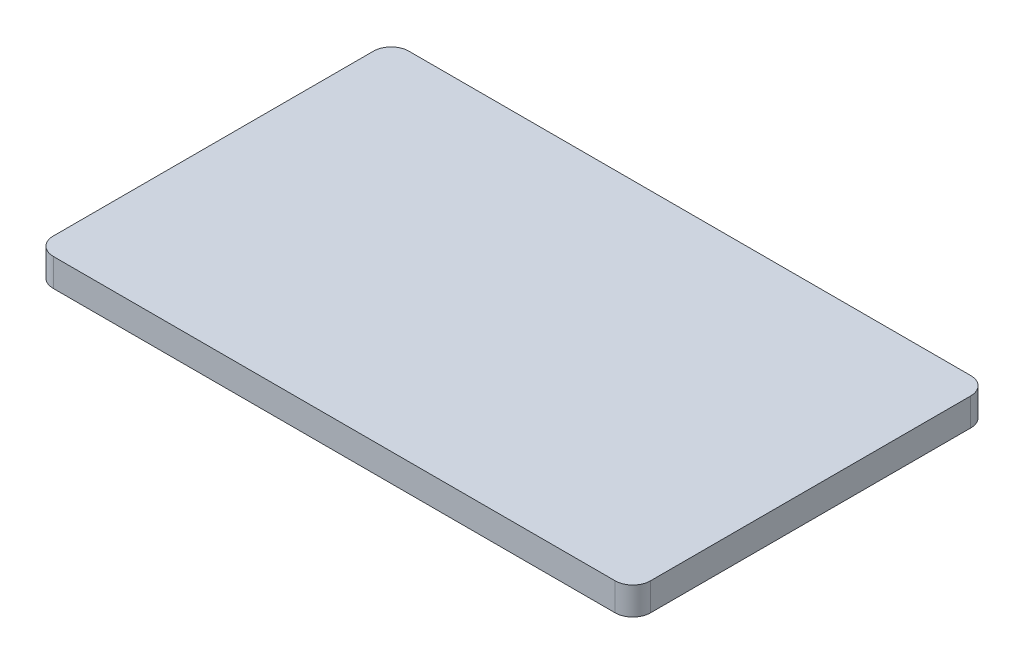
ISO-10303-21;
HEADER;
FILE_DESCRIPTION(('STEP AP214'),'2;1');
FILE_NAME('part.step','',(''),(''),'','','');
FILE_SCHEMA(('AUTOMOTIVE_DESIGN { 1 0 10303 214 1 1 1 1 }'));
ENDSEC;
DATA;
#1=APPLICATION_CONTEXT('core data for automotive mechanical design processes');
#2=APPLICATION_PROTOCOL_DEFINITION('international standard','automotive_design',2000,#1);
#3=PRODUCT_CONTEXT('',#1,'mechanical');
#4=PRODUCT('Part','Part','',(#3));
#5=PRODUCT_RELATED_PRODUCT_CATEGORY('part','',(#4));
#6=PRODUCT_DEFINITION_FORMATION('','',#4);
#7=PRODUCT_DEFINITION_CONTEXT('part definition',#1,'design');
#8=PRODUCT_DEFINITION('design','',#6,#7);
#9=PRODUCT_DEFINITION_SHAPE('','',#8);
#10=(LENGTH_UNIT() NAMED_UNIT(*) SI_UNIT(.MILLI.,.METRE.));
#11=(NAMED_UNIT(*) PLANE_ANGLE_UNIT() SI_UNIT($,.RADIAN.));
#12=(NAMED_UNIT(*) SI_UNIT($,.STERADIAN.) SOLID_ANGLE_UNIT());
#13=UNCERTAINTY_MEASURE_WITH_UNIT(LENGTH_MEASURE(1.E-05),#10,'distance_accuracy_value','');
#14=(GEOMETRIC_REPRESENTATION_CONTEXT(3) GLOBAL_UNCERTAINTY_ASSIGNED_CONTEXT((#13)) GLOBAL_UNIT_ASSIGNED_CONTEXT((#10,
#11,#12)) REPRESENTATION_CONTEXT('',''));
#15=CARTESIAN_POINT('',(0.,0.,0.));
#16=DIRECTION('',(0.,0.,1.));
#17=DIRECTION('',(1.,0.,0.));
#18=AXIS2_PLACEMENT_3D('',#15,#16,#17);
#19=CARTESIAN_POINT('',(107.5,10.,64.0000000000002));
#20=DIRECTION('',(-1.,0.,0.));
#21=DIRECTION('',(0.,0.,1.));
#22=AXIS2_PLACEMENT_3D('',#19,#20,#21);
#23=PLANE('',#22);
#24=DIRECTION('',(0.,0.,-1.));
#25=VECTOR('',#24,1.);
#26=CARTESIAN_POINT('',(107.5,10.,64.0000000000002));
#27=LINE('',#26,#25);
#28=CARTESIAN_POINT('',(107.5,10.,57.6500000000002));
#29=VERTEX_POINT('',#28);
#30=CARTESIAN_POINT('',(107.5,10.,-57.65));
#31=VERTEX_POINT('',#30);
#32=EDGE_CURVE('E129',#29,#31,#27,.T.);
#33=ORIENTED_EDGE('',*,*,#32,.F.);
#34=DIRECTION('',(0.,-1.,0.));
#35=VECTOR('',#34,1.);
#36=CARTESIAN_POINT('',(107.5,10.,57.6500000000002));
#37=LINE('',#36,#35);
#38=CARTESIAN_POINT('',(107.5,0.,57.6500000000002));
#39=VERTEX_POINT('',#38);
#40=EDGE_CURVE('E11',#29,#39,#37,.T.);
#41=ORIENTED_EDGE('',*,*,#40,.T.);
#42=DIRECTION('',(0.,0.,-1.));
#43=VECTOR('',#42,1.);
#44=CARTESIAN_POINT('',(107.5,0.,64.0000000000004));
#45=LINE('',#44,#43);
#46=CARTESIAN_POINT('',(107.5,0.,-57.65));
#47=VERTEX_POINT('',#46);
#48=EDGE_CURVE('E131',#39,#47,#45,.T.);
#49=ORIENTED_EDGE('',*,*,#48,.T.);
#50=DIRECTION('',(0.,-1.,0.));
#51=VECTOR('',#50,1.);
#52=CARTESIAN_POINT('',(107.5,10.,-57.65));
#53=LINE('',#52,#51);
#54=EDGE_CURVE('E42',#47,#31,#53,.F.);
#55=ORIENTED_EDGE('',*,*,#54,.T.);
#56=EDGE_LOOP('',(#33,#41,#49,#55));
#57=FACE_BOUND('',#56,.T.);
#58=ADVANCED_FACE('F34',(#57),#23,.F.);
#59=CARTESIAN_POINT('',(-107.5,10.,-63.9999999999996));
#60=DIRECTION('',(0.,0.,1.));
#61=DIRECTION('',(1.,0.,0.));
#62=AXIS2_PLACEMENT_3D('',#59,#60,#61);
#63=PLANE('',#62);
#64=DIRECTION('',(-1.,0.,0.));
#65=VECTOR('',#64,1.);
#66=CARTESIAN_POINT('',(-107.5,1.94289029309402E-13,-64.));
#67=LINE('',#66,#65);
#68=CARTESIAN_POINT('',(101.15,0.,-64.));
#69=VERTEX_POINT('',#68);
#70=CARTESIAN_POINT('',(-101.15,1.94289029309402E-13,-64.));
#71=VERTEX_POINT('',#70);
#72=EDGE_CURVE('E127',#69,#71,#67,.T.);
#73=ORIENTED_EDGE('',*,*,#72,.T.);
#74=DIRECTION('',(0.,-1.,0.));
#75=VECTOR('',#74,1.);
#76=CARTESIAN_POINT('',(-101.15,10.0000000000002,-63.9999999999996));
#77=LINE('',#76,#75);
#78=CARTESIAN_POINT('',(-101.15,10.0000000000002,-63.9999999999996));
#79=VERTEX_POINT('',#78);
#80=EDGE_CURVE('E106',#71,#79,#77,.F.);
#81=ORIENTED_EDGE('',*,*,#80,.T.);
#82=DIRECTION('',(-1.,0.,0.));
#83=VECTOR('',#82,1.);
#84=CARTESIAN_POINT('',(-107.5,10.,-63.9999999999996));
#85=LINE('',#84,#83);
#86=CARTESIAN_POINT('',(101.15,10.,-64.));
#87=VERTEX_POINT('',#86);
#88=EDGE_CURVE('E167',#87,#79,#85,.T.);
#89=ORIENTED_EDGE('',*,*,#88,.F.);
#90=DIRECTION('',(0.,-1.,0.));
#91=VECTOR('',#90,1.);
#92=CARTESIAN_POINT('',(101.15,10.,-64.));
#93=LINE('',#92,#91);
#94=EDGE_CURVE('E111',#87,#69,#93,.T.);
#95=ORIENTED_EDGE('',*,*,#94,.T.);
#96=EDGE_LOOP('',(#73,#81,#89,#95));
#97=FACE_BOUND('',#96,.T.);
#98=ADVANCED_FACE('F171',(#97),#63,.F.);
#99=CARTESIAN_POINT('',(-107.5,10.,64.));
#100=DIRECTION('',(1.,0.,0.));
#101=DIRECTION('',(0.,0.,-1.));
#102=AXIS2_PLACEMENT_3D('',#99,#100,#101);
#103=PLANE('',#102);
#104=DIRECTION('',(0.,0.,1.));
#105=VECTOR('',#104,1.);
#106=CARTESIAN_POINT('',(-107.5,10.,64.));
#107=LINE('',#106,#105);
#108=CARTESIAN_POINT('',(-107.5,10.,-57.6499999999996));
#109=VERTEX_POINT('',#108);
#110=CARTESIAN_POINT('',(-107.5,10.,57.65));
#111=VERTEX_POINT('',#110);
#112=EDGE_CURVE('E120',#109,#111,#107,.T.);
#113=ORIENTED_EDGE('',*,*,#112,.F.);
#114=DIRECTION('',(0.,-1.,0.));
#115=VECTOR('',#114,1.);
#116=CARTESIAN_POINT('',(-107.5,10.,-57.6499999999996));
#117=LINE('',#116,#115);
#118=CARTESIAN_POINT('',(-107.5,0.,-57.65));
#119=VERTEX_POINT('',#118);
#120=EDGE_CURVE('E105',#109,#119,#117,.T.);
#121=ORIENTED_EDGE('',*,*,#120,.T.);
#122=DIRECTION('',(0.,0.,1.));
#123=VECTOR('',#122,1.);
#124=CARTESIAN_POINT('',(-107.5,1.94289029309402E-13,64.));
#125=LINE('',#124,#123);
#126=CARTESIAN_POINT('',(-107.5,0.,57.6500000000002));
#127=VERTEX_POINT('',#126);
#128=EDGE_CURVE('E118',#119,#127,#125,.T.);
#129=ORIENTED_EDGE('',*,*,#128,.T.);
#130=DIRECTION('',(0.,-1.,0.));
#131=VECTOR('',#130,1.);
#132=CARTESIAN_POINT('',(-107.5,10.,57.65));
#133=LINE('',#132,#131);
#134=EDGE_CURVE('E122',#127,#111,#133,.F.);
#135=ORIENTED_EDGE('',*,*,#134,.T.);
#136=EDGE_LOOP('',(#113,#121,#129,#135));
#137=FACE_BOUND('',#136,.T.);
#138=ADVANCED_FACE('F117',(#137),#103,.F.);
#139=CARTESIAN_POINT('',(-107.5,10.,64.));
#140=DIRECTION('',(0.,0.,-1.));
#141=DIRECTION('',(-1.,0.,0.));
#142=AXIS2_PLACEMENT_3D('',#139,#140,#141);
#143=PLANE('',#142);
#144=DIRECTION('',(1.,0.,0.));
#145=VECTOR('',#144,1.);
#146=CARTESIAN_POINT('',(-107.5,10.,64.));
#147=LINE('',#146,#145);
#148=CARTESIAN_POINT('',(-101.15,9.99999999999998,64.));
#149=VERTEX_POINT('',#148);
#150=CARTESIAN_POINT('',(101.15,10.,64.0000000000002));
#151=VERTEX_POINT('',#150);
#152=EDGE_CURVE('E135',#149,#151,#147,.T.);
#153=ORIENTED_EDGE('',*,*,#152,.F.);
#154=DIRECTION('',(0.,-1.,0.));
#155=VECTOR('',#154,1.);
#156=CARTESIAN_POINT('',(-101.15,9.99999999999998,64.));
#157=LINE('',#156,#155);
#158=CARTESIAN_POINT('',(-101.15,0.,64.));
#159=VERTEX_POINT('',#158);
#160=EDGE_CURVE('E152',#149,#159,#157,.T.);
#161=ORIENTED_EDGE('',*,*,#160,.T.);
#162=DIRECTION('',(1.,0.,0.));
#163=VECTOR('',#162,1.);
#164=CARTESIAN_POINT('',(-107.5,1.94289029309402E-13,64.));
#165=LINE('',#164,#163);
#166=CARTESIAN_POINT('',(101.15,0.,64.0000000000004));
#167=VERTEX_POINT('',#166);
#168=EDGE_CURVE('E126',#159,#167,#165,.T.);
#169=ORIENTED_EDGE('',*,*,#168,.T.);
#170=DIRECTION('',(0.,-1.,0.));
#171=VECTOR('',#170,1.);
#172=CARTESIAN_POINT('',(101.15,10.,64.0000000000002));
#173=LINE('',#172,#171);
#174=EDGE_CURVE('E49',#167,#151,#173,.F.);
#175=ORIENTED_EDGE('',*,*,#174,.T.);
#176=EDGE_LOOP('',(#153,#161,#169,#175));
#177=FACE_BOUND('',#176,.T.);
#178=ADVANCED_FACE('F178',(#177),#143,.F.);
#179=CARTESIAN_POINT('',(0.,10.,0.));
#180=DIRECTION('',(0.,-1.,0.));
#181=DIRECTION('',(0.,0.,-1.));
#182=AXIS2_PLACEMENT_3D('',#179,#180,#181);
#183=PLANE('',#182);
#184=ORIENTED_EDGE('',*,*,#88,.T.);
#185=CARTESIAN_POINT('',(-101.15,10.,-57.6499999999996));
#186=DIRECTION('',(0.,-1.,0.));
#187=DIRECTION('',(0.,0.,-1.));
#188=AXIS2_PLACEMENT_3D('',#185,#186,#187);
#189=CIRCLE('',#188,6.35);
#190=EDGE_CURVE('E149',#79,#109,#189,.F.);
#191=ORIENTED_EDGE('',*,*,#190,.T.);
#192=ORIENTED_EDGE('',*,*,#112,.T.);
#193=CARTESIAN_POINT('',(-101.15,10.,57.65));
#194=DIRECTION('',(0.,-1.,0.));
#195=DIRECTION('',(0.,0.,-1.));
#196=AXIS2_PLACEMENT_3D('',#193,#194,#195);
#197=CIRCLE('',#196,6.35);
#198=EDGE_CURVE('E56',#111,#149,#197,.F.);
#199=ORIENTED_EDGE('',*,*,#198,.T.);
#200=ORIENTED_EDGE('',*,*,#152,.T.);
#201=CARTESIAN_POINT('',(101.15,10.,57.6500000000002));
#202=DIRECTION('',(0.,-1.,0.));
#203=DIRECTION('',(0.,0.,-1.));
#204=AXIS2_PLACEMENT_3D('',#201,#202,#203);
#205=CIRCLE('',#204,6.35);
#206=EDGE_CURVE('E146',#151,#29,#205,.F.);
#207=ORIENTED_EDGE('',*,*,#206,.T.);
#208=ORIENTED_EDGE('',*,*,#32,.T.);
#209=CARTESIAN_POINT('',(101.15,10.,-57.65));
#210=DIRECTION('',(0.,-1.,0.));
#211=DIRECTION('',(0.,0.,-1.));
#212=AXIS2_PLACEMENT_3D('',#209,#210,#211);
#213=CIRCLE('',#212,6.35);
#214=EDGE_CURVE('E144',#31,#87,#213,.F.);
#215=ORIENTED_EDGE('',*,*,#214,.T.);
#216=EDGE_LOOP('',(#184,#191,#192,#199,#200,#207,#208,#215));
#217=FACE_BOUND('',#216,.T.);
#218=ADVANCED_FACE('F164',(#217),#183,.F.);
#219=CARTESIAN_POINT('',(0.,0.,0.));
#220=DIRECTION('',(0.,-1.,0.));
#221=DIRECTION('',(0.,0.,-1.));
#222=AXIS2_PLACEMENT_3D('',#219,#220,#221);
#223=PLANE('',#222);
#224=ORIENTED_EDGE('',*,*,#128,.F.);
#225=CARTESIAN_POINT('',(-101.15,0.,-57.65));
#226=DIRECTION('',(0.,-1.,0.));
#227=DIRECTION('',(0.,0.,-1.));
#228=AXIS2_PLACEMENT_3D('',#225,#226,#227);
#229=CIRCLE('',#228,6.35);
#230=EDGE_CURVE('E101',#119,#71,#229,.T.);
#231=ORIENTED_EDGE('',*,*,#230,.T.);
#232=ORIENTED_EDGE('',*,*,#72,.F.);
#233=CARTESIAN_POINT('',(101.15,0.,-57.65));
#234=DIRECTION('',(0.,-1.,0.));
#235=DIRECTION('',(0.,0.,-1.));
#236=AXIS2_PLACEMENT_3D('',#233,#234,#235);
#237=CIRCLE('',#236,6.35);
#238=EDGE_CURVE('E121',#69,#47,#237,.T.);
#239=ORIENTED_EDGE('',*,*,#238,.T.);
#240=ORIENTED_EDGE('',*,*,#48,.F.);
#241=CARTESIAN_POINT('',(101.15,0.,57.6500000000002));
#242=DIRECTION('',(0.,-1.,0.));
#243=DIRECTION('',(0.,0.,-1.));
#244=AXIS2_PLACEMENT_3D('',#241,#242,#243);
#245=CIRCLE('',#244,6.35);
#246=EDGE_CURVE('E138',#39,#167,#245,.T.);
#247=ORIENTED_EDGE('',*,*,#246,.T.);
#248=ORIENTED_EDGE('',*,*,#168,.F.);
#249=CARTESIAN_POINT('',(-101.15,0.,57.6500000000002));
#250=DIRECTION('',(0.,-1.,0.));
#251=DIRECTION('',(0.,0.,-1.));
#252=AXIS2_PLACEMENT_3D('',#249,#250,#251);
#253=CIRCLE('',#252,6.35);
#254=EDGE_CURVE('E112',#159,#127,#253,.T.);
#255=ORIENTED_EDGE('',*,*,#254,.T.);
#256=EDGE_LOOP('',(#224,#231,#232,#239,#240,#247,#248,#255));
#257=FACE_BOUND('',#256,.T.);
#258=ADVANCED_FACE('F124',(#257),#223,.T.);
#259=CARTESIAN_POINT('',(-101.15,10.,-57.6499999999996));
#260=DIRECTION('',(0.,-1.,0.));
#261=DIRECTION('',(0.,0.,-1.));
#262=AXIS2_PLACEMENT_3D('',#259,#260,#261);
#263=CYLINDRICAL_SURFACE('',#262,6.35);
#264=ORIENTED_EDGE('',*,*,#190,.F.);
#265=ORIENTED_EDGE('',*,*,#80,.F.);
#266=ORIENTED_EDGE('',*,*,#230,.F.);
#267=ORIENTED_EDGE('',*,*,#120,.F.);
#268=EDGE_LOOP('',(#264,#265,#266,#267));
#269=FACE_BOUND('',#268,.T.);
#270=ADVANCED_FACE('F104',(#269),#263,.T.);
#271=CARTESIAN_POINT('',(-101.15,10.,57.65));
#272=DIRECTION('',(0.,-1.,0.));
#273=DIRECTION('',(0.,0.,-1.));
#274=AXIS2_PLACEMENT_3D('',#271,#272,#273);
#275=CYLINDRICAL_SURFACE('',#274,6.35);
#276=ORIENTED_EDGE('',*,*,#198,.F.);
#277=ORIENTED_EDGE('',*,*,#134,.F.);
#278=ORIENTED_EDGE('',*,*,#254,.F.);
#279=ORIENTED_EDGE('',*,*,#160,.F.);
#280=EDGE_LOOP('',(#276,#277,#278,#279));
#281=FACE_BOUND('',#280,.T.);
#282=ADVANCED_FACE('F177',(#281),#275,.T.);
#283=CARTESIAN_POINT('',(101.15,10.,57.6500000000002));
#284=DIRECTION('',(0.,-1.,0.));
#285=DIRECTION('',(0.,0.,-1.));
#286=AXIS2_PLACEMENT_3D('',#283,#284,#285);
#287=CYLINDRICAL_SURFACE('',#286,6.35);
#288=ORIENTED_EDGE('',*,*,#206,.F.);
#289=ORIENTED_EDGE('',*,*,#174,.F.);
#290=ORIENTED_EDGE('',*,*,#246,.F.);
#291=ORIENTED_EDGE('',*,*,#40,.F.);
#292=EDGE_LOOP('',(#288,#289,#290,#291));
#293=FACE_BOUND('',#292,.T.);
#294=ADVANCED_FACE('F180',(#293),#287,.T.);
#295=CARTESIAN_POINT('',(101.15,10.,-57.65));
#296=DIRECTION('',(0.,-1.,0.));
#297=DIRECTION('',(0.,0.,-1.));
#298=AXIS2_PLACEMENT_3D('',#295,#296,#297);
#299=CYLINDRICAL_SURFACE('',#298,6.35);
#300=ORIENTED_EDGE('',*,*,#214,.F.);
#301=ORIENTED_EDGE('',*,*,#54,.F.);
#302=ORIENTED_EDGE('',*,*,#238,.F.);
#303=ORIENTED_EDGE('',*,*,#94,.F.);
#304=EDGE_LOOP('',(#300,#301,#302,#303));
#305=FACE_BOUND('',#304,.T.);
#306=ADVANCED_FACE('F36',(#305),#299,.T.);
#307=CLOSED_SHELL('',(#58,#98,#138,#178,#218,#258,#270,#282,#294,#306));
#308=MANIFOLD_SOLID_BREP('B2',#307);
#309=ADVANCED_BREP_SHAPE_REPRESENTATION('',(#18,#308),#14);
#310=SHAPE_DEFINITION_REPRESENTATION(#9,#309);
ENDSEC;
END-ISO-10303-21;
